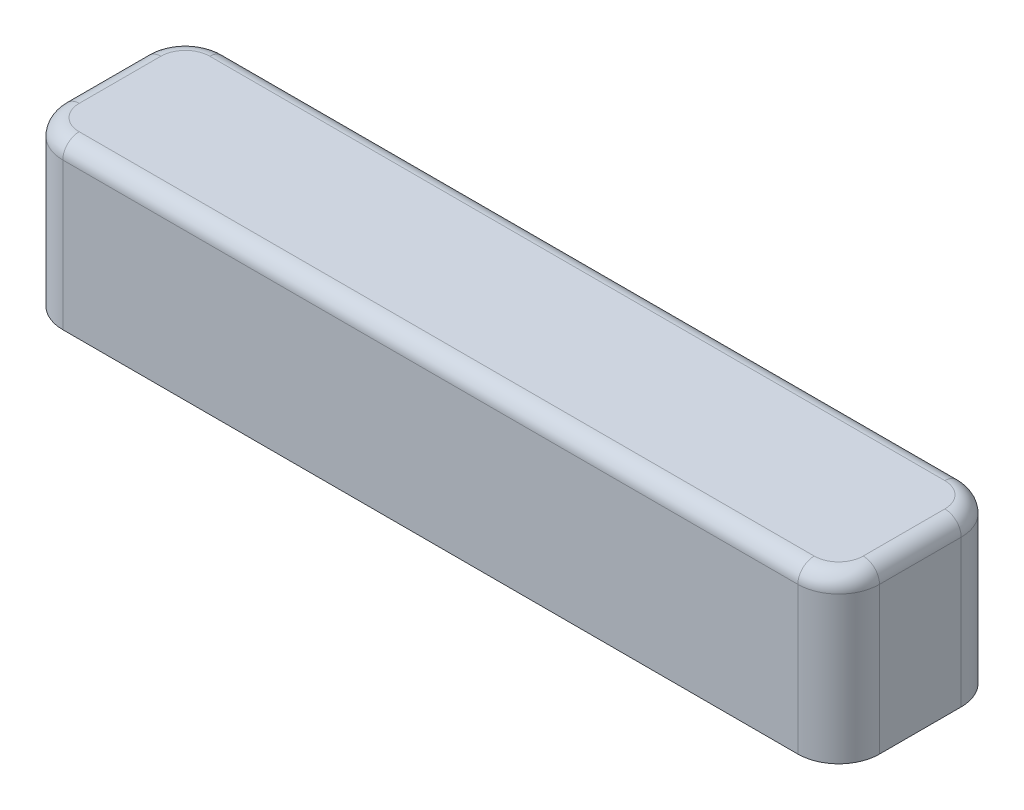
ISO-10303-21;
HEADER;
FILE_DESCRIPTION(('STEP AP214'),'2;1');
FILE_NAME('part.step','',(''),(''),'','','');
FILE_SCHEMA(('AUTOMOTIVE_DESIGN { 1 0 10303 214 1 1 1 1 }'));
ENDSEC;
DATA;
#1=APPLICATION_CONTEXT('core data for automotive mechanical design processes');
#2=APPLICATION_PROTOCOL_DEFINITION('international standard','automotive_design',2000,#1);
#3=PRODUCT_CONTEXT('',#1,'mechanical');
#4=PRODUCT('Part','Part','',(#3));
#5=PRODUCT_RELATED_PRODUCT_CATEGORY('part','',(#4));
#6=PRODUCT_DEFINITION_FORMATION('','',#4);
#7=PRODUCT_DEFINITION_CONTEXT('part definition',#1,'design');
#8=PRODUCT_DEFINITION('design','',#6,#7);
#9=PRODUCT_DEFINITION_SHAPE('','',#8);
#10=(LENGTH_UNIT() NAMED_UNIT(*) SI_UNIT(.MILLI.,.METRE.));
#11=(NAMED_UNIT(*) PLANE_ANGLE_UNIT() SI_UNIT($,.RADIAN.));
#12=(NAMED_UNIT(*) SI_UNIT($,.STERADIAN.) SOLID_ANGLE_UNIT());
#13=UNCERTAINTY_MEASURE_WITH_UNIT(LENGTH_MEASURE(1.E-05),#10,'distance_accuracy_value','');
#14=(GEOMETRIC_REPRESENTATION_CONTEXT(3) GLOBAL_UNCERTAINTY_ASSIGNED_CONTEXT((#13)) GLOBAL_UNIT_ASSIGNED_CONTEXT((#10,
#11,#12)) REPRESENTATION_CONTEXT('',''));
#15=CARTESIAN_POINT('',(0.,0.,0.));
#16=DIRECTION('',(0.,0.,1.));
#17=DIRECTION('',(1.,0.,0.));
#18=AXIS2_PLACEMENT_3D('',#15,#16,#17);
#19=CARTESIAN_POINT('',(0.,2.,0.));
#20=DIRECTION('',(1.,0.,0.));
#21=DIRECTION('',(0.,0.,-1.));
#22=AXIS2_PLACEMENT_3D('',#19,#20,#21);
#23=PLANE('',#22);
#24=DIRECTION('',(0.,0.,1.));
#25=VECTOR('',#24,1.);
#26=CARTESIAN_POINT('',(0.,1.8,0.));
#27=LINE('',#26,#25);
#28=CARTESIAN_POINT('',(0.,1.8,-0.5));
#29=VERTEX_POINT('',#28);
#30=CARTESIAN_POINT('',(0.,1.8,-1.5));
#31=VERTEX_POINT('',#30);
#32=EDGE_CURVE('E140',#29,#31,#27,.F.);
#33=ORIENTED_EDGE('',*,*,#32,.T.);
#34=DIRECTION('',(0.,-1.,0.));
#35=VECTOR('',#34,1.);
#36=CARTESIAN_POINT('',(0.,2.,-1.5));
#37=LINE('',#36,#35);
#38=CARTESIAN_POINT('',(0.,0.,-1.5));
#39=VERTEX_POINT('',#38);
#40=EDGE_CURVE('E126',#31,#39,#37,.T.);
#41=ORIENTED_EDGE('',*,*,#40,.T.);
#42=DIRECTION('',(0.,0.,1.));
#43=VECTOR('',#42,1.);
#44=CARTESIAN_POINT('',(0.,0.,0.));
#45=LINE('',#44,#43);
#46=CARTESIAN_POINT('',(0.,0.,-0.5));
#47=VERTEX_POINT('',#46);
#48=EDGE_CURVE('E137',#39,#47,#45,.T.);
#49=ORIENTED_EDGE('',*,*,#48,.T.);
#50=DIRECTION('',(0.,-1.,0.));
#51=VECTOR('',#50,1.);
#52=CARTESIAN_POINT('',(0.,2.,-0.5));
#53=LINE('',#52,#51);
#54=EDGE_CURVE('E143',#47,#29,#53,.F.);
#55=ORIENTED_EDGE('',*,*,#54,.T.);
#56=EDGE_LOOP('',(#33,#41,#49,#55));
#57=FACE_BOUND('',#56,.T.);
#58=ADVANCED_FACE('F34',(#57),#23,.F.);
#59=CARTESIAN_POINT('',(0.,2.,0.));
#60=DIRECTION('',(0.,0.,-1.));
#61=DIRECTION('',(-1.,0.,0.));
#62=AXIS2_PLACEMENT_3D('',#59,#60,#61);
#63=PLANE('',#62);
#64=DIRECTION('',(1.,0.,0.));
#65=VECTOR('',#64,1.);
#66=CARTESIAN_POINT('',(0.,1.8,0.));
#67=LINE('',#66,#65);
#68=CARTESIAN_POINT('',(9.5,1.8,0.));
#69=VERTEX_POINT('',#68);
#70=CARTESIAN_POINT('',(0.5,1.8,0.));
#71=VERTEX_POINT('',#70);
#72=EDGE_CURVE('E170',#69,#71,#67,.F.);
#73=ORIENTED_EDGE('',*,*,#72,.T.);
#74=DIRECTION('',(0.,-1.,0.));
#75=VECTOR('',#74,1.);
#76=CARTESIAN_POINT('',(0.5,2.,0.));
#77=LINE('',#76,#75);
#78=CARTESIAN_POINT('',(0.5,0.,0.));
#79=VERTEX_POINT('',#78);
#80=EDGE_CURVE('E174',#71,#79,#77,.T.);
#81=ORIENTED_EDGE('',*,*,#80,.T.);
#82=DIRECTION('',(1.,0.,0.));
#83=VECTOR('',#82,1.);
#84=CARTESIAN_POINT('',(0.,0.,0.));
#85=LINE('',#84,#83);
#86=CARTESIAN_POINT('',(9.5,0.,0.));
#87=VERTEX_POINT('',#86);
#88=EDGE_CURVE('E148',#79,#87,#85,.T.);
#89=ORIENTED_EDGE('',*,*,#88,.T.);
#90=DIRECTION('',(0.,-1.,0.));
#91=VECTOR('',#90,1.);
#92=CARTESIAN_POINT('',(9.5,2.,0.));
#93=LINE('',#92,#91);
#94=EDGE_CURVE('E172',#87,#69,#93,.F.);
#95=ORIENTED_EDGE('',*,*,#94,.T.);
#96=EDGE_LOOP('',(#73,#81,#89,#95));
#97=FACE_BOUND('',#96,.T.);
#98=ADVANCED_FACE('F272',(#97),#63,.F.);
#99=CARTESIAN_POINT('',(10.,2.,0.));
#100=DIRECTION('',(-1.,0.,0.));
#101=DIRECTION('',(0.,0.,1.));
#102=AXIS2_PLACEMENT_3D('',#99,#100,#101);
#103=PLANE('',#102);
#104=DIRECTION('',(0.,0.,-1.));
#105=VECTOR('',#104,1.);
#106=CARTESIAN_POINT('',(10.,0.,0.));
#107=LINE('',#106,#105);
#108=CARTESIAN_POINT('',(10.,0.,-0.5));
#109=VERTEX_POINT('',#108);
#110=CARTESIAN_POINT('',(10.,0.,-1.5));
#111=VERTEX_POINT('',#110);
#112=EDGE_CURVE('E151',#109,#111,#107,.T.);
#113=ORIENTED_EDGE('',*,*,#112,.T.);
#114=DIRECTION('',(0.,-1.,0.));
#115=VECTOR('',#114,1.);
#116=CARTESIAN_POINT('',(10.,2.,-1.5));
#117=LINE('',#116,#115);
#118=CARTESIAN_POINT('',(10.,1.8,-1.5));
#119=VERTEX_POINT('',#118);
#120=EDGE_CURVE('E180',#111,#119,#117,.F.);
#121=ORIENTED_EDGE('',*,*,#120,.T.);
#122=DIRECTION('',(0.,0.,-1.));
#123=VECTOR('',#122,1.);
#124=CARTESIAN_POINT('',(10.,1.8,0.));
#125=LINE('',#124,#123);
#126=CARTESIAN_POINT('',(10.,1.8,-0.5));
#127=VERTEX_POINT('',#126);
#128=EDGE_CURVE('E176',#119,#127,#125,.F.);
#129=ORIENTED_EDGE('',*,*,#128,.T.);
#130=DIRECTION('',(0.,-1.,0.));
#131=VECTOR('',#130,1.);
#132=CARTESIAN_POINT('',(10.,2.,-0.5));
#133=LINE('',#132,#131);
#134=EDGE_CURVE('E178',#127,#109,#133,.T.);
#135=ORIENTED_EDGE('',*,*,#134,.T.);
#136=EDGE_LOOP('',(#113,#121,#129,#135));
#137=FACE_BOUND('',#136,.T.);
#138=ADVANCED_FACE('F241',(#137),#103,.F.);
#139=CARTESIAN_POINT('',(0.,2.,-2.));
#140=DIRECTION('',(0.,0.,1.));
#141=DIRECTION('',(1.,0.,0.));
#142=AXIS2_PLACEMENT_3D('',#139,#140,#141);
#143=PLANE('',#142);
#144=DIRECTION('',(-1.,0.,0.));
#145=VECTOR('',#144,1.);
#146=CARTESIAN_POINT('',(0.,0.,-2.));
#147=LINE('',#146,#145);
#148=CARTESIAN_POINT('',(9.5,0.,-2.));
#149=VERTEX_POINT('',#148);
#150=CARTESIAN_POINT('',(0.5,0.,-2.));
#151=VERTEX_POINT('',#150);
#152=EDGE_CURVE('E158',#149,#151,#147,.T.);
#153=ORIENTED_EDGE('',*,*,#152,.T.);
#154=DIRECTION('',(0.,-1.,0.));
#155=VECTOR('',#154,1.);
#156=CARTESIAN_POINT('',(0.5,2.,-2.));
#157=LINE('',#156,#155);
#158=CARTESIAN_POINT('',(0.5,1.8,-2.));
#159=VERTEX_POINT('',#158);
#160=EDGE_CURVE('E127',#151,#159,#157,.F.);
#161=ORIENTED_EDGE('',*,*,#160,.T.);
#162=DIRECTION('',(-1.,0.,0.));
#163=VECTOR('',#162,1.);
#164=CARTESIAN_POINT('',(0.,1.8,-2.));
#165=LINE('',#164,#163);
#166=CARTESIAN_POINT('',(9.5,1.8,-2.));
#167=VERTEX_POINT('',#166);
#168=EDGE_CURVE('E132',#159,#167,#165,.F.);
#169=ORIENTED_EDGE('',*,*,#168,.T.);
#170=DIRECTION('',(0.,-1.,0.));
#171=VECTOR('',#170,1.);
#172=CARTESIAN_POINT('',(9.5,2.,-2.));
#173=LINE('',#172,#171);
#174=EDGE_CURVE('E167',#167,#149,#173,.T.);
#175=ORIENTED_EDGE('',*,*,#174,.T.);
#176=EDGE_LOOP('',(#153,#161,#169,#175));
#177=FACE_BOUND('',#176,.T.);
#178=ADVANCED_FACE('F384',(#177),#143,.F.);
#179=CARTESIAN_POINT('',(0.,2.,0.));
#180=DIRECTION('',(0.,-1.,0.));
#181=DIRECTION('',(0.,0.,-1.));
#182=AXIS2_PLACEMENT_3D('',#179,#180,#181);
#183=PLANE('',#182);
#184=CARTESIAN_POINT('',(9.5,2.,-0.5));
#185=DIRECTION('',(0.,-1.,0.));
#186=DIRECTION('',(0.,0.,-1.));
#187=AXIS2_PLACEMENT_3D('',#184,#185,#186);
#188=CIRCLE('',#187,0.3);
#189=CARTESIAN_POINT('',(9.8,2.,-0.5));
#190=VERTEX_POINT('',#189);
#191=CARTESIAN_POINT('',(9.5,2.,-0.2));
#192=VERTEX_POINT('',#191);
#193=EDGE_CURVE('E54',#190,#192,#188,.T.);
#194=ORIENTED_EDGE('',*,*,#193,.F.);
#195=DIRECTION('',(0.,0.,-1.));
#196=VECTOR('',#195,1.);
#197=CARTESIAN_POINT('',(9.8,2.,0.));
#198=LINE('',#197,#196);
#199=CARTESIAN_POINT('',(9.8,2.,-1.5));
#200=VERTEX_POINT('',#199);
#201=EDGE_CURVE('E12',#190,#200,#198,.T.);
#202=ORIENTED_EDGE('',*,*,#201,.T.);
#203=CARTESIAN_POINT('',(9.5,2.,-1.5));
#204=DIRECTION('',(0.,-1.,0.));
#205=DIRECTION('',(0.,0.,-1.));
#206=AXIS2_PLACEMENT_3D('',#203,#204,#205);
#207=CIRCLE('',#206,0.3);
#208=CARTESIAN_POINT('',(9.5,2.,-1.8));
#209=VERTEX_POINT('',#208);
#210=EDGE_CURVE('E43',#209,#200,#207,.T.);
#211=ORIENTED_EDGE('',*,*,#210,.F.);
#212=DIRECTION('',(-1.,0.,0.));
#213=VECTOR('',#212,1.);
#214=CARTESIAN_POINT('',(0.,2.,-1.8));
#215=LINE('',#214,#213);
#216=CARTESIAN_POINT('',(0.5,2.,-1.8));
#217=VERTEX_POINT('',#216);
#218=EDGE_CURVE('E191',#209,#217,#215,.T.);
#219=ORIENTED_EDGE('',*,*,#218,.T.);
#220=CARTESIAN_POINT('',(0.5,2.,-1.5));
#221=DIRECTION('',(0.,-1.,0.));
#222=DIRECTION('',(0.,0.,-1.));
#223=AXIS2_PLACEMENT_3D('',#220,#221,#222);
#224=CIRCLE('',#223,0.3);
#225=CARTESIAN_POINT('',(0.2,2.,-1.5));
#226=VERTEX_POINT('',#225);
#227=EDGE_CURVE('E189',#226,#217,#224,.T.);
#228=ORIENTED_EDGE('',*,*,#227,.F.);
#229=DIRECTION('',(0.,0.,1.));
#230=VECTOR('',#229,1.);
#231=CARTESIAN_POINT('',(0.2,2.,0.));
#232=LINE('',#231,#230);
#233=CARTESIAN_POINT('',(0.2,2.,-0.5));
#234=VERTEX_POINT('',#233);
#235=EDGE_CURVE('E185',#226,#234,#232,.T.);
#236=ORIENTED_EDGE('',*,*,#235,.T.);
#237=CARTESIAN_POINT('',(0.5,2.,-0.5));
#238=DIRECTION('',(0.,-1.,0.));
#239=DIRECTION('',(0.,0.,-1.));
#240=AXIS2_PLACEMENT_3D('',#237,#238,#239);
#241=CIRCLE('',#240,0.3);
#242=CARTESIAN_POINT('',(0.5,2.,-0.2));
#243=VERTEX_POINT('',#242);
#244=EDGE_CURVE('E182',#243,#234,#241,.T.);
#245=ORIENTED_EDGE('',*,*,#244,.F.);
#246=DIRECTION('',(1.,0.,0.));
#247=VECTOR('',#246,1.);
#248=CARTESIAN_POINT('',(0.,2.,-0.2));
#249=LINE('',#248,#247);
#250=EDGE_CURVE('E187',#243,#192,#249,.T.);
#251=ORIENTED_EDGE('',*,*,#250,.T.);
#252=EDGE_LOOP('',(#194,#202,#211,#219,#228,#236,#245,#251));
#253=FACE_BOUND('',#252,.T.);
#254=ADVANCED_FACE('F251',(#253),#183,.F.);
#255=CARTESIAN_POINT('',(0.,0.,0.));
#256=DIRECTION('',(0.,-1.,0.));
#257=DIRECTION('',(0.,0.,-1.));
#258=AXIS2_PLACEMENT_3D('',#255,#256,#257);
#259=PLANE('',#258);
#260=ORIENTED_EDGE('',*,*,#48,.F.);
#261=CARTESIAN_POINT('',(0.5,0.,-1.5));
#262=DIRECTION('',(0.,-1.,0.));
#263=DIRECTION('',(0.,0.,-1.));
#264=AXIS2_PLACEMENT_3D('',#261,#262,#263);
#265=CIRCLE('',#264,0.5);
#266=EDGE_CURVE('E122',#39,#151,#265,.T.);
#267=ORIENTED_EDGE('',*,*,#266,.T.);
#268=ORIENTED_EDGE('',*,*,#152,.F.);
#269=CARTESIAN_POINT('',(9.5,0.,-1.5));
#270=DIRECTION('',(0.,-1.,0.));
#271=DIRECTION('',(0.,0.,-1.));
#272=AXIS2_PLACEMENT_3D('',#269,#270,#271);
#273=CIRCLE('',#272,0.5);
#274=EDGE_CURVE('E163',#149,#111,#273,.T.);
#275=ORIENTED_EDGE('',*,*,#274,.T.);
#276=ORIENTED_EDGE('',*,*,#112,.F.);
#277=CARTESIAN_POINT('',(9.5,0.,-0.5));
#278=DIRECTION('',(0.,-1.,0.));
#279=DIRECTION('',(0.,0.,-1.));
#280=AXIS2_PLACEMENT_3D('',#277,#278,#279);
#281=CIRCLE('',#280,0.5);
#282=EDGE_CURVE('E142',#109,#87,#281,.T.);
#283=ORIENTED_EDGE('',*,*,#282,.T.);
#284=ORIENTED_EDGE('',*,*,#88,.F.);
#285=CARTESIAN_POINT('',(0.5,0.,-0.5));
#286=DIRECTION('',(0.,-1.,0.));
#287=DIRECTION('',(0.,0.,-1.));
#288=AXIS2_PLACEMENT_3D('',#285,#286,#287);
#289=CIRCLE('',#288,0.5);
#290=EDGE_CURVE('E133',#79,#47,#289,.T.);
#291=ORIENTED_EDGE('',*,*,#290,.T.);
#292=EDGE_LOOP('',(#260,#267,#268,#275,#276,#283,#284,#291));
#293=FACE_BOUND('',#292,.T.);
#294=ADVANCED_FACE('F145',(#293),#259,.T.);
#295=CARTESIAN_POINT('',(9.5,2.,-0.5));
#296=DIRECTION('',(0.,-1.,0.));
#297=DIRECTION('',(0.,0.,-1.));
#298=AXIS2_PLACEMENT_3D('',#295,#296,#297);
#299=CYLINDRICAL_SURFACE('',#298,0.5);
#300=CARTESIAN_POINT('',(9.5,1.8,-0.5));
#301=DIRECTION('',(0.,-1.,0.));
#302=DIRECTION('',(0.,0.,-1.));
#303=AXIS2_PLACEMENT_3D('',#300,#301,#302);
#304=CIRCLE('',#303,0.5);
#305=EDGE_CURVE('E38',#69,#127,#304,.F.);
#306=ORIENTED_EDGE('',*,*,#305,.F.);
#307=ORIENTED_EDGE('',*,*,#94,.F.);
#308=ORIENTED_EDGE('',*,*,#282,.F.);
#309=ORIENTED_EDGE('',*,*,#134,.F.);
#310=EDGE_LOOP('',(#306,#307,#308,#309));
#311=FACE_BOUND('',#310,.T.);
#312=ADVANCED_FACE('F36',(#311),#299,.T.);
#313=CARTESIAN_POINT('',(9.5,1.8,-0.5));
#314=DIRECTION('',(0.,-1.,0.));
#315=DIRECTION('',(0.,0.,-1.));
#316=AXIS2_PLACEMENT_3D('',#313,#314,#315);
#317=TOROIDAL_SURFACE('',#316,0.3,0.2);
#318=CARTESIAN_POINT('',(9.5,1.8,-0.2));
#319=DIRECTION('',(1.,0.,0.));
#320=DIRECTION('',(0.,0.,-1.));
#321=AXIS2_PLACEMENT_3D('',#318,#319,#320);
#322=CIRCLE('',#321,0.2);
#323=EDGE_CURVE('E223',#69,#192,#322,.F.);
#324=ORIENTED_EDGE('',*,*,#323,.F.);
#325=ORIENTED_EDGE('',*,*,#305,.T.);
#326=CARTESIAN_POINT('',(9.8,1.8,-0.5));
#327=DIRECTION('',(0.,0.,1.));
#328=DIRECTION('',(1.,0.,0.));
#329=AXIS2_PLACEMENT_3D('',#326,#327,#328);
#330=CIRCLE('',#329,0.2);
#331=EDGE_CURVE('E154',#190,#127,#330,.F.);
#332=ORIENTED_EDGE('',*,*,#331,.F.);
#333=ORIENTED_EDGE('',*,*,#193,.T.);
#334=EDGE_LOOP('',(#324,#325,#332,#333));
#335=FACE_BOUND('',#334,.T.);
#336=ADVANCED_FACE('F232',(#335),#317,.T.);
#337=CARTESIAN_POINT('',(9.5,2.,-1.5));
#338=DIRECTION('',(0.,-1.,0.));
#339=DIRECTION('',(0.,0.,-1.));
#340=AXIS2_PLACEMENT_3D('',#337,#338,#339);
#341=CYLINDRICAL_SURFACE('',#340,0.5);
#342=ORIENTED_EDGE('',*,*,#274,.F.);
#343=ORIENTED_EDGE('',*,*,#174,.F.);
#344=CARTESIAN_POINT('',(9.5,1.8,-1.5));
#345=DIRECTION('',(0.,-1.,0.));
#346=DIRECTION('',(0.,0.,-1.));
#347=AXIS2_PLACEMENT_3D('',#344,#345,#346);
#348=CIRCLE('',#347,0.5);
#349=EDGE_CURVE('E220',#119,#167,#348,.F.);
#350=ORIENTED_EDGE('',*,*,#349,.F.);
#351=ORIENTED_EDGE('',*,*,#120,.F.);
#352=EDGE_LOOP('',(#342,#343,#350,#351));
#353=FACE_BOUND('',#352,.T.);
#354=ADVANCED_FACE('F246',(#353),#341,.T.);
#355=CARTESIAN_POINT('',(9.8,1.8,0.));
#356=DIRECTION('',(0.,0.,-1.));
#357=DIRECTION('',(-1.,0.,0.));
#358=AXIS2_PLACEMENT_3D('',#355,#356,#357);
#359=CYLINDRICAL_SURFACE('',#358,0.2);
#360=ORIENTED_EDGE('',*,*,#331,.T.);
#361=ORIENTED_EDGE('',*,*,#128,.F.);
#362=CARTESIAN_POINT('',(9.8,1.8,-1.5));
#363=DIRECTION('',(0.,0.,-1.));
#364=DIRECTION('',(-1.,0.,0.));
#365=AXIS2_PLACEMENT_3D('',#362,#363,#364);
#366=CIRCLE('',#365,0.2);
#367=EDGE_CURVE('E217',#200,#119,#366,.T.);
#368=ORIENTED_EDGE('',*,*,#367,.F.);
#369=ORIENTED_EDGE('',*,*,#201,.F.);
#370=EDGE_LOOP('',(#360,#361,#368,#369));
#371=FACE_BOUND('',#370,.T.);
#372=ADVANCED_FACE('F228',(#371),#359,.T.);
#373=CARTESIAN_POINT('',(0.,1.8,-0.2));
#374=DIRECTION('',(1.,0.,0.));
#375=DIRECTION('',(0.,0.,-1.));
#376=AXIS2_PLACEMENT_3D('',#373,#374,#375);
#377=CYLINDRICAL_SURFACE('',#376,0.2);
#378=ORIENTED_EDGE('',*,*,#323,.T.);
#379=ORIENTED_EDGE('',*,*,#250,.F.);
#380=CARTESIAN_POINT('',(0.5,1.8,-0.2));
#381=DIRECTION('',(-1.,0.,0.));
#382=DIRECTION('',(0.,0.,1.));
#383=AXIS2_PLACEMENT_3D('',#380,#381,#382);
#384=CIRCLE('',#383,0.2);
#385=EDGE_CURVE('E214',#71,#243,#384,.T.);
#386=ORIENTED_EDGE('',*,*,#385,.F.);
#387=ORIENTED_EDGE('',*,*,#72,.F.);
#388=EDGE_LOOP('',(#378,#379,#386,#387));
#389=FACE_BOUND('',#388,.T.);
#390=ADVANCED_FACE('F269',(#389),#377,.T.);
#391=CARTESIAN_POINT('',(0.5,2.,-0.5));
#392=DIRECTION('',(0.,-1.,0.));
#393=DIRECTION('',(0.,0.,-1.));
#394=AXIS2_PLACEMENT_3D('',#391,#392,#393);
#395=CYLINDRICAL_SURFACE('',#394,0.5);
#396=ORIENTED_EDGE('',*,*,#290,.F.);
#397=ORIENTED_EDGE('',*,*,#80,.F.);
#398=CARTESIAN_POINT('',(0.5,1.8,-0.5));
#399=DIRECTION('',(0.,-1.,0.));
#400=DIRECTION('',(0.,0.,-1.));
#401=AXIS2_PLACEMENT_3D('',#398,#399,#400);
#402=CIRCLE('',#401,0.5);
#403=EDGE_CURVE('E211',#29,#71,#402,.F.);
#404=ORIENTED_EDGE('',*,*,#403,.F.);
#405=ORIENTED_EDGE('',*,*,#54,.F.);
#406=EDGE_LOOP('',(#396,#397,#404,#405));
#407=FACE_BOUND('',#406,.T.);
#408=ADVANCED_FACE('F274',(#407),#395,.T.);
#409=CARTESIAN_POINT('',(9.5,1.8,-1.5));
#410=DIRECTION('',(0.,-1.,0.));
#411=DIRECTION('',(0.,0.,-1.));
#412=AXIS2_PLACEMENT_3D('',#409,#410,#411);
#413=TOROIDAL_SURFACE('',#412,0.3,0.2);
#414=ORIENTED_EDGE('',*,*,#367,.T.);
#415=ORIENTED_EDGE('',*,*,#349,.T.);
#416=CARTESIAN_POINT('',(9.5,1.8,-1.8));
#417=DIRECTION('',(1.,0.,0.));
#418=DIRECTION('',(0.,0.,-1.));
#419=AXIS2_PLACEMENT_3D('',#416,#417,#418);
#420=CIRCLE('',#419,0.2);
#421=EDGE_CURVE('E208',#209,#167,#420,.F.);
#422=ORIENTED_EDGE('',*,*,#421,.F.);
#423=ORIENTED_EDGE('',*,*,#210,.T.);
#424=EDGE_LOOP('',(#414,#415,#422,#423));
#425=FACE_BOUND('',#424,.T.);
#426=ADVANCED_FACE('F249',(#425),#413,.T.);
#427=CARTESIAN_POINT('',(0.5,1.8,-0.5));
#428=DIRECTION('',(0.,-1.,0.));
#429=DIRECTION('',(0.,0.,-1.));
#430=AXIS2_PLACEMENT_3D('',#427,#428,#429);
#431=TOROIDAL_SURFACE('',#430,0.3,0.2);
#432=ORIENTED_EDGE('',*,*,#385,.T.);
#433=ORIENTED_EDGE('',*,*,#244,.T.);
#434=CARTESIAN_POINT('',(0.2,1.8,-0.5));
#435=DIRECTION('',(0.,0.,1.));
#436=DIRECTION('',(1.,0.,0.));
#437=AXIS2_PLACEMENT_3D('',#434,#435,#436);
#438=CIRCLE('',#437,0.2);
#439=EDGE_CURVE('E205',#29,#234,#438,.F.);
#440=ORIENTED_EDGE('',*,*,#439,.F.);
#441=ORIENTED_EDGE('',*,*,#403,.T.);
#442=EDGE_LOOP('',(#432,#433,#440,#441));
#443=FACE_BOUND('',#442,.T.);
#444=ADVANCED_FACE('F265',(#443),#431,.T.);
#445=CARTESIAN_POINT('',(0.,1.8,-1.8));
#446=DIRECTION('',(-1.,0.,0.));
#447=DIRECTION('',(0.,0.,1.));
#448=AXIS2_PLACEMENT_3D('',#445,#446,#447);
#449=CYLINDRICAL_SURFACE('',#448,0.2);
#450=ORIENTED_EDGE('',*,*,#421,.T.);
#451=ORIENTED_EDGE('',*,*,#168,.F.);
#452=CARTESIAN_POINT('',(0.5,1.8,-1.8));
#453=DIRECTION('',(-1.,0.,0.));
#454=DIRECTION('',(0.,0.,1.));
#455=AXIS2_PLACEMENT_3D('',#452,#453,#454);
#456=CIRCLE('',#455,0.2);
#457=EDGE_CURVE('E202',#217,#159,#456,.T.);
#458=ORIENTED_EDGE('',*,*,#457,.F.);
#459=ORIENTED_EDGE('',*,*,#218,.F.);
#460=EDGE_LOOP('',(#450,#451,#458,#459));
#461=FACE_BOUND('',#460,.T.);
#462=ADVANCED_FACE('F255',(#461),#449,.T.);
#463=CARTESIAN_POINT('',(0.2,1.8,0.));
#464=DIRECTION('',(0.,0.,1.));
#465=DIRECTION('',(1.,0.,0.));
#466=AXIS2_PLACEMENT_3D('',#463,#464,#465);
#467=CYLINDRICAL_SURFACE('',#466,0.2);
#468=ORIENTED_EDGE('',*,*,#439,.T.);
#469=ORIENTED_EDGE('',*,*,#235,.F.);
#470=CARTESIAN_POINT('',(0.2,1.8,-1.5));
#471=DIRECTION('',(0.,0.,-1.));
#472=DIRECTION('',(-1.,0.,0.));
#473=AXIS2_PLACEMENT_3D('',#470,#471,#472);
#474=CIRCLE('',#473,0.2);
#475=EDGE_CURVE('E199',#31,#226,#474,.T.);
#476=ORIENTED_EDGE('',*,*,#475,.F.);
#477=ORIENTED_EDGE('',*,*,#32,.F.);
#478=EDGE_LOOP('',(#468,#469,#476,#477));
#479=FACE_BOUND('',#478,.T.);
#480=ADVANCED_FACE('F261',(#479),#467,.T.);
#481=CARTESIAN_POINT('',(0.5,1.8,-1.5));
#482=DIRECTION('',(0.,-1.,0.));
#483=DIRECTION('',(0.,0.,-1.));
#484=AXIS2_PLACEMENT_3D('',#481,#482,#483);
#485=TOROIDAL_SURFACE('',#484,0.3,0.2);
#486=ORIENTED_EDGE('',*,*,#227,.T.);
#487=ORIENTED_EDGE('',*,*,#457,.T.);
#488=CARTESIAN_POINT('',(0.5,1.8,-1.5));
#489=DIRECTION('',(0.,-1.,0.));
#490=DIRECTION('',(0.,0.,-1.));
#491=AXIS2_PLACEMENT_3D('',#488,#489,#490);
#492=CIRCLE('',#491,0.5);
#493=EDGE_CURVE('E197',#31,#159,#492,.T.);
#494=ORIENTED_EDGE('',*,*,#493,.F.);
#495=ORIENTED_EDGE('',*,*,#475,.T.);
#496=EDGE_LOOP('',(#486,#487,#494,#495));
#497=FACE_BOUND('',#496,.T.);
#498=ADVANCED_FACE('F259',(#497),#485,.T.);
#499=CARTESIAN_POINT('',(0.5,2.,-1.5));
#500=DIRECTION('',(0.,-1.,0.));
#501=DIRECTION('',(0.,0.,-1.));
#502=AXIS2_PLACEMENT_3D('',#499,#500,#501);
#503=CYLINDRICAL_SURFACE('',#502,0.5);
#504=ORIENTED_EDGE('',*,*,#493,.T.);
#505=ORIENTED_EDGE('',*,*,#160,.F.);
#506=ORIENTED_EDGE('',*,*,#266,.F.);
#507=ORIENTED_EDGE('',*,*,#40,.F.);
#508=EDGE_LOOP('',(#504,#505,#506,#507));
#509=FACE_BOUND('',#508,.T.);
#510=ADVANCED_FACE('F125',(#509),#503,.T.);
#511=CLOSED_SHELL('',(#58,#98,#138,#178,#254,#294,#312,#336,#354,#372,#390,#408,#426,#444,#462,
#480,#498,#510));
#512=MANIFOLD_SOLID_BREP('B2',#511);
#513=ADVANCED_BREP_SHAPE_REPRESENTATION('',(#18,#512),#14);
#514=SHAPE_DEFINITION_REPRESENTATION(#9,#513);
ENDSEC;
END-ISO-10303-21;
